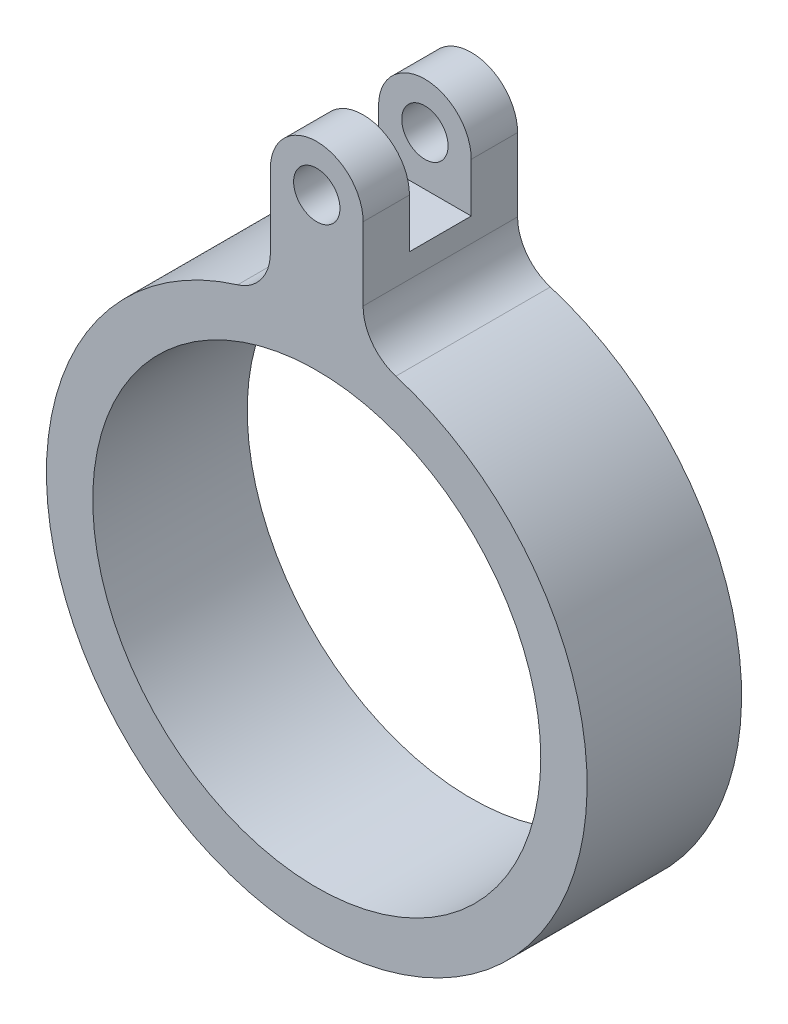
ISO-10303-21;
HEADER;
FILE_DESCRIPTION(('STEP AP214'),'2;1');
FILE_NAME('part.step','',(''),(''),'','','');
FILE_SCHEMA(('AUTOMOTIVE_DESIGN { 1 0 10303 214 1 1 1 1 }'));
ENDSEC;
DATA;
#1=APPLICATION_CONTEXT('core data for automotive mechanical design processes');
#2=APPLICATION_PROTOCOL_DEFINITION('international standard','automotive_design',2000,#1);
#3=PRODUCT_CONTEXT('',#1,'mechanical');
#4=PRODUCT('Part','Part','',(#3));
#5=PRODUCT_RELATED_PRODUCT_CATEGORY('part','',(#4));
#6=PRODUCT_DEFINITION_FORMATION('','',#4);
#7=PRODUCT_DEFINITION_CONTEXT('part definition',#1,'design');
#8=PRODUCT_DEFINITION('design','',#6,#7);
#9=PRODUCT_DEFINITION_SHAPE('','',#8);
#10=(LENGTH_UNIT() NAMED_UNIT(*) SI_UNIT(.MILLI.,.METRE.));
#11=(NAMED_UNIT(*) PLANE_ANGLE_UNIT() SI_UNIT($,.RADIAN.));
#12=(NAMED_UNIT(*) SI_UNIT($,.STERADIAN.) SOLID_ANGLE_UNIT());
#13=UNCERTAINTY_MEASURE_WITH_UNIT(LENGTH_MEASURE(1.E-05),#10,'distance_accuracy_value','');
#14=(GEOMETRIC_REPRESENTATION_CONTEXT(3) GLOBAL_UNCERTAINTY_ASSIGNED_CONTEXT((#13)) GLOBAL_UNIT_ASSIGNED_CONTEXT((#10,
#11,#12)) REPRESENTATION_CONTEXT('',''));
#15=CARTESIAN_POINT('',(0.,0.,0.));
#16=DIRECTION('',(0.,0.,1.));
#17=DIRECTION('',(1.,0.,0.));
#18=AXIS2_PLACEMENT_3D('',#15,#16,#17);
#19=CARTESIAN_POINT('',(-3.,19.2508213160359,0.));
#20=DIRECTION('',(-1.,0.,0.));
#21=DIRECTION('',(0.,0.,1.));
#22=AXIS2_PLACEMENT_3D('',#19,#20,#21);
#23=PLANE('',#22);
#24=DIRECTION('',(0.,0.,-1.));
#25=VECTOR('',#24,1.);
#26=CARTESIAN_POINT('',(-3.,21.1484024479483,0.));
#27=LINE('',#26,#25);
#28=CARTESIAN_POINT('',(-3.,21.1484024479483,7.));
#29=VERTEX_POINT('',#28);
#30=CARTESIAN_POINT('',(-3.,21.1484024479483,3.));
#31=VERTEX_POINT('',#30);
#32=EDGE_CURVE('E136',#29,#31,#27,.T.);
#33=ORIENTED_EDGE('',*,*,#32,.T.);
#34=DIRECTION('',(0.,1.,0.));
#35=VECTOR('',#34,1.);
#36=CARTESIAN_POINT('',(-3.,19.2508213160359,3.));
#37=LINE('',#36,#35);
#38=CARTESIAN_POINT('',(-3.,24.3278757810565,3.));
#39=VERTEX_POINT('',#38);
#40=EDGE_CURVE('E147',#31,#39,#37,.T.);
#41=ORIENTED_EDGE('',*,*,#40,.T.);
#42=DIRECTION('',(0.,0.,1.));
#43=VECTOR('',#42,1.);
#44=CARTESIAN_POINT('',(-3.,24.3278757810565,0.));
#45=LINE('',#44,#43);
#46=CARTESIAN_POINT('',(-3.,24.3278757810565,0.));
#47=VERTEX_POINT('',#46);
#48=EDGE_CURVE('E179',#47,#39,#45,.T.);
#49=ORIENTED_EDGE('',*,*,#48,.F.);
#50=DIRECTION('',(0.,-1.,0.));
#51=VECTOR('',#50,1.);
#52=CARTESIAN_POINT('',(-3.,24.3278757810565,0.));
#53=LINE('',#52,#51);
#54=CARTESIAN_POINT('',(-3.,19.6022957839127,0.));
#55=VERTEX_POINT('',#54);
#56=EDGE_CURVE('E171',#47,#55,#53,.T.);
#57=ORIENTED_EDGE('',*,*,#56,.T.);
#58=DIRECTION('',(0.,0.,-1.));
#59=VECTOR('',#58,1.);
#60=CARTESIAN_POINT('',(-3.,19.6022957839127,0.));
#61=LINE('',#60,#59);
#62=CARTESIAN_POINT('',(-3.,19.6022957839127,10.));
#63=VERTEX_POINT('',#62);
#64=EDGE_CURVE('E201',#55,#63,#61,.F.);
#65=ORIENTED_EDGE('',*,*,#64,.T.);
#66=DIRECTION('',(0.,-1.,0.));
#67=VECTOR('',#66,1.);
#68=CARTESIAN_POINT('',(-3.,19.2508213160359,10.));
#69=LINE('',#68,#67);
#70=CARTESIAN_POINT('',(-3.,24.3278757810565,10.));
#71=VERTEX_POINT('',#70);
#72=EDGE_CURVE('E172',#71,#63,#69,.T.);
#73=ORIENTED_EDGE('',*,*,#72,.F.);
#74=CARTESIAN_POINT('',(-3.,24.3278757810565,7.));
#75=VERTEX_POINT('',#74);
#76=EDGE_CURVE('E183',#75,#71,#45,.T.);
#77=ORIENTED_EDGE('',*,*,#76,.F.);
#78=DIRECTION('',(0.,1.,0.));
#79=VECTOR('',#78,1.);
#80=CARTESIAN_POINT('',(-3.,19.2508213160359,7.));
#81=LINE('',#80,#79);
#82=EDGE_CURVE('E60',#29,#75,#81,.T.);
#83=ORIENTED_EDGE('',*,*,#82,.F.);
#84=EDGE_LOOP('',(#33,#41,#49,#57,#65,#73,#77,#83));
#85=FACE_BOUND('',#84,.T.);
#86=ADVANCED_FACE('F45',(#85),#23,.T.);
#87=CARTESIAN_POINT('',(3.,24.3278757810565,0.));
#88=DIRECTION('',(1.,0.,0.));
#89=DIRECTION('',(0.,0.,-1.));
#90=AXIS2_PLACEMENT_3D('',#87,#88,#89);
#91=PLANE('',#90);
#92=DIRECTION('',(0.,0.,1.));
#93=VECTOR('',#92,1.);
#94=CARTESIAN_POINT('',(3.,24.3278757810565,0.));
#95=LINE('',#94,#93);
#96=CARTESIAN_POINT('',(3.,24.3278757810565,0.));
#97=VERTEX_POINT('',#96);
#98=CARTESIAN_POINT('',(3.,24.3278757810565,3.));
#99=VERTEX_POINT('',#98);
#100=EDGE_CURVE('E144',#97,#99,#95,.T.);
#101=ORIENTED_EDGE('',*,*,#100,.T.);
#102=DIRECTION('',(0.,-1.,0.));
#103=VECTOR('',#102,1.);
#104=CARTESIAN_POINT('',(3.,24.3278757810565,3.));
#105=LINE('',#104,#103);
#106=CARTESIAN_POINT('',(3.,21.1484024479483,3.));
#107=VERTEX_POINT('',#106);
#108=EDGE_CURVE('E142',#99,#107,#105,.T.);
#109=ORIENTED_EDGE('',*,*,#108,.T.);
#110=DIRECTION('',(0.,0.,1.));
#111=VECTOR('',#110,1.);
#112=CARTESIAN_POINT('',(3.,21.1484024479483,0.));
#113=LINE('',#112,#111);
#114=CARTESIAN_POINT('',(3.,21.1484024479483,7.));
#115=VERTEX_POINT('',#114);
#116=EDGE_CURVE('E13',#107,#115,#113,.T.);
#117=ORIENTED_EDGE('',*,*,#116,.T.);
#118=DIRECTION('',(0.,-1.,0.));
#119=VECTOR('',#118,1.);
#120=CARTESIAN_POINT('',(3.,24.3278757810565,7.));
#121=LINE('',#120,#119);
#122=CARTESIAN_POINT('',(3.,24.3278757810565,7.));
#123=VERTEX_POINT('',#122);
#124=EDGE_CURVE('E122',#123,#115,#121,.T.);
#125=ORIENTED_EDGE('',*,*,#124,.F.);
#126=CARTESIAN_POINT('',(3.,24.3278757810565,10.));
#127=VERTEX_POINT('',#126);
#128=EDGE_CURVE('E175',#123,#127,#95,.T.);
#129=ORIENTED_EDGE('',*,*,#128,.T.);
#130=DIRECTION('',(0.,1.,0.));
#131=VECTOR('',#130,1.);
#132=CARTESIAN_POINT('',(3.,24.3278757810565,10.));
#133=LINE('',#132,#131);
#134=CARTESIAN_POINT('',(3.,19.6022957839127,10.));
#135=VERTEX_POINT('',#134);
#136=EDGE_CURVE('E166',#135,#127,#133,.T.);
#137=ORIENTED_EDGE('',*,*,#136,.F.);
#138=DIRECTION('',(0.,0.,-1.));
#139=VECTOR('',#138,1.);
#140=CARTESIAN_POINT('',(3.,19.6022957839127,0.));
#141=LINE('',#140,#139);
#142=CARTESIAN_POINT('',(3.,19.6022957839127,0.));
#143=VERTEX_POINT('',#142);
#144=EDGE_CURVE('E203',#135,#143,#141,.T.);
#145=ORIENTED_EDGE('',*,*,#144,.T.);
#146=DIRECTION('',(0.,1.,0.));
#147=VECTOR('',#146,1.);
#148=CARTESIAN_POINT('',(3.,16.4304412725826,0.));
#149=LINE('',#148,#147);
#150=EDGE_CURVE('E169',#143,#97,#149,.T.);
#151=ORIENTED_EDGE('',*,*,#150,.T.);
#152=EDGE_LOOP('',(#101,#109,#117,#125,#129,#137,#145,#151));
#153=FACE_BOUND('',#152,.T.);
#154=ADVANCED_FACE('F141',(#153),#91,.T.);
#155=CARTESIAN_POINT('',(0.,24.3278757810565,0.));
#156=DIRECTION('',(0.,0.,1.));
#157=DIRECTION('',(1.,0.,0.));
#158=AXIS2_PLACEMENT_3D('',#155,#156,#157);
#159=CYLINDRICAL_SURFACE('',#158,3.);
#160=ORIENTED_EDGE('',*,*,#48,.T.);
#161=CARTESIAN_POINT('',(0.,24.3278757810565,3.));
#162=DIRECTION('',(0.,0.,1.));
#163=DIRECTION('',(1.,0.,0.));
#164=AXIS2_PLACEMENT_3D('',#161,#162,#163);
#165=CIRCLE('',#164,3.);
#166=EDGE_CURVE('E148',#39,#99,#165,.F.);
#167=ORIENTED_EDGE('',*,*,#166,.T.);
#168=ORIENTED_EDGE('',*,*,#100,.F.);
#169=CARTESIAN_POINT('',(0.,24.3278757810565,0.));
#170=DIRECTION('',(0.,0.,1.));
#171=DIRECTION('',(1.,0.,0.));
#172=AXIS2_PLACEMENT_3D('',#169,#170,#171);
#173=CIRCLE('',#172,3.);
#174=EDGE_CURVE('E164',#97,#47,#173,.T.);
#175=ORIENTED_EDGE('',*,*,#174,.T.);
#176=EDGE_LOOP('',(#160,#167,#168,#175));
#177=FACE_BOUND('',#176,.T.);
#178=ADVANCED_FACE('F247',(#177),#159,.T.);
#179=CARTESIAN_POINT('',(0.,24.3278757810565,0.));
#180=DIRECTION('',(0.,0.,1.));
#181=DIRECTION('',(1.,0.,0.));
#182=AXIS2_PLACEMENT_3D('',#179,#180,#181);
#183=CYLINDRICAL_SURFACE('',#182,1.5);
#184=CARTESIAN_POINT('',(0.,24.3278757810565,0.));
#185=DIRECTION('',(0.,0.,1.));
#186=DIRECTION('',(1.,0.,0.));
#187=AXIS2_PLACEMENT_3D('',#184,#185,#186);
#188=CIRCLE('',#187,1.5);
#189=CARTESIAN_POINT('',(1.5,24.3278757810565,0.));
#190=VERTEX_POINT('',#189);
#191=EDGE_CURVE('E158',#190,#190,#188,.T.);
#192=ORIENTED_EDGE('',*,*,#191,.F.);
#193=EDGE_LOOP('',(#192));
#194=FACE_BOUND('',#193,.T.);
#195=CARTESIAN_POINT('',(0.,24.3278757810565,3.));
#196=DIRECTION('',(0.,0.,1.));
#197=DIRECTION('',(1.,0.,0.));
#198=AXIS2_PLACEMENT_3D('',#195,#196,#197);
#199=CIRCLE('',#198,1.5);
#200=CARTESIAN_POINT('',(1.5,24.3278757810565,3.));
#201=VERTEX_POINT('',#200);
#202=EDGE_CURVE('E152',#201,#201,#199,.F.);
#203=ORIENTED_EDGE('',*,*,#202,.F.);
#204=EDGE_LOOP('',(#203));
#205=FACE_BOUND('',#204,.T.);
#206=ADVANCED_FACE('F259',(#194,#205),#183,.F.);
#207=CARTESIAN_POINT('',(0.,0.,10.));
#208=DIRECTION('',(0.,0.,1.));
#209=DIRECTION('',(1.,0.,0.));
#210=AXIS2_PLACEMENT_3D('',#207,#208,#209);
#211=PLANE('',#210);
#212=CARTESIAN_POINT('',(0.,24.3278757810565,10.));
#213=DIRECTION('',(0.,0.,1.));
#214=DIRECTION('',(1.,0.,0.));
#215=AXIS2_PLACEMENT_3D('',#212,#213,#214);
#216=CIRCLE('',#215,1.5);
#217=CARTESIAN_POINT('',(1.5,24.3278757810565,10.));
#218=VERTEX_POINT('',#217);
#219=EDGE_CURVE('E157',#218,#218,#216,.T.);
#220=ORIENTED_EDGE('',*,*,#219,.F.);
#221=EDGE_LOOP('',(#220));
#222=FACE_BOUND('',#221,.T.);
#223=CARTESIAN_POINT('',(0.,0.,10.));
#224=DIRECTION('',(0.,0.,1.));
#225=DIRECTION('',(1.,0.,0.));
#226=AXIS2_PLACEMENT_3D('',#223,#224,#225);
#227=CIRCLE('',#226,17.5);
#228=CARTESIAN_POINT('',(-5.1219512195122,16.7336671326084,10.));
#229=VERTEX_POINT('',#228);
#230=CARTESIAN_POINT('',(5.1219512195122,16.7336671326084,10.));
#231=VERTEX_POINT('',#230);
#232=EDGE_CURVE('E191',#229,#231,#227,.T.);
#233=ORIENTED_EDGE('',*,*,#232,.T.);
#234=CARTESIAN_POINT('',(6.,19.6022957839127,10.));
#235=DIRECTION('',(0.,0.,1.));
#236=DIRECTION('',(1.,0.,0.));
#237=AXIS2_PLACEMENT_3D('',#234,#235,#236);
#238=CIRCLE('',#237,3.);
#239=EDGE_CURVE('E68',#231,#135,#238,.F.);
#240=ORIENTED_EDGE('',*,*,#239,.T.);
#241=ORIENTED_EDGE('',*,*,#136,.T.);
#242=CARTESIAN_POINT('',(0.,24.3278757810565,10.));
#243=DIRECTION('',(0.,0.,1.));
#244=DIRECTION('',(1.,0.,0.));
#245=AXIS2_PLACEMENT_3D('',#242,#243,#244);
#246=CIRCLE('',#245,3.);
#247=EDGE_CURVE('E161',#127,#71,#246,.T.);
#248=ORIENTED_EDGE('',*,*,#247,.T.);
#249=ORIENTED_EDGE('',*,*,#72,.T.);
#250=CARTESIAN_POINT('',(-6.,19.6022957839127,10.));
#251=DIRECTION('',(0.,0.,1.));
#252=DIRECTION('',(1.,0.,0.));
#253=AXIS2_PLACEMENT_3D('',#250,#251,#252);
#254=CIRCLE('',#253,3.);
#255=EDGE_CURVE('E207',#63,#229,#254,.F.);
#256=ORIENTED_EDGE('',*,*,#255,.T.);
#257=EDGE_LOOP('',(#233,#240,#241,#248,#249,#256));
#258=FACE_BOUND('',#257,.T.);
#259=CARTESIAN_POINT('',(0.,0.,10.));
#260=DIRECTION('',(0.,0.,1.));
#261=DIRECTION('',(1.,0.,0.));
#262=AXIS2_PLACEMENT_3D('',#259,#260,#261);
#263=CIRCLE('',#262,14.5);
#264=CARTESIAN_POINT('',(14.5,0.,10.));
#265=VERTEX_POINT('',#264);
#266=EDGE_CURVE('E185',#265,#265,#263,.T.);
#267=ORIENTED_EDGE('',*,*,#266,.F.);
#268=EDGE_LOOP('',(#267));
#269=FACE_BOUND('',#268,.T.);
#270=ADVANCED_FACE('F225',(#222,#258,#269),#211,.T.);
#271=CARTESIAN_POINT('',(0.,0.,0.));
#272=DIRECTION('',(0.,0.,1.));
#273=DIRECTION('',(1.,0.,0.));
#274=AXIS2_PLACEMENT_3D('',#271,#272,#273);
#275=PLANE('',#274);
#276=ORIENTED_EDGE('',*,*,#191,.T.);
#277=EDGE_LOOP('',(#276));
#278=FACE_BOUND('',#277,.T.);
#279=ORIENTED_EDGE('',*,*,#56,.F.);
#280=ORIENTED_EDGE('',*,*,#174,.F.);
#281=ORIENTED_EDGE('',*,*,#150,.F.);
#282=CARTESIAN_POINT('',(6.,19.6022957839127,0.));
#283=DIRECTION('',(0.,0.,1.));
#284=DIRECTION('',(1.,0.,0.));
#285=AXIS2_PLACEMENT_3D('',#282,#283,#284);
#286=CIRCLE('',#285,3.);
#287=CARTESIAN_POINT('',(5.1219512195122,16.7336671326084,0.));
#288=VERTEX_POINT('',#287);
#289=EDGE_CURVE('E53',#143,#288,#286,.T.);
#290=ORIENTED_EDGE('',*,*,#289,.T.);
#291=CARTESIAN_POINT('',(0.,0.,0.));
#292=DIRECTION('',(0.,0.,1.));
#293=DIRECTION('',(1.,0.,0.));
#294=AXIS2_PLACEMENT_3D('',#291,#292,#293);
#295=CIRCLE('',#294,17.5);
#296=CARTESIAN_POINT('',(-5.1219512195122,16.7336671326084,0.));
#297=VERTEX_POINT('',#296);
#298=EDGE_CURVE('E188',#297,#288,#295,.T.);
#299=ORIENTED_EDGE('',*,*,#298,.F.);
#300=CARTESIAN_POINT('',(-6.,19.6022957839127,0.));
#301=DIRECTION('',(0.,0.,1.));
#302=DIRECTION('',(1.,0.,0.));
#303=AXIS2_PLACEMENT_3D('',#300,#301,#302);
#304=CIRCLE('',#303,3.);
#305=EDGE_CURVE('E205',#297,#55,#304,.T.);
#306=ORIENTED_EDGE('',*,*,#305,.T.);
#307=EDGE_LOOP('',(#279,#280,#281,#290,#299,#306));
#308=FACE_BOUND('',#307,.T.);
#309=CARTESIAN_POINT('',(0.,0.,0.));
#310=DIRECTION('',(0.,0.,1.));
#311=DIRECTION('',(1.,0.,0.));
#312=AXIS2_PLACEMENT_3D('',#309,#310,#311);
#313=CIRCLE('',#312,14.5);
#314=CARTESIAN_POINT('',(14.5,0.,0.));
#315=VERTEX_POINT('',#314);
#316=EDGE_CURVE('E182',#315,#315,#313,.T.);
#317=ORIENTED_EDGE('',*,*,#316,.T.);
#318=EDGE_LOOP('',(#317));
#319=FACE_BOUND('',#318,.T.);
#320=ADVANCED_FACE('F236',(#278,#308,#319),#275,.F.);
#321=CARTESIAN_POINT('',(0.,0.,10.));
#322=DIRECTION('',(0.,0.,-1.));
#323=DIRECTION('',(-1.,0.,0.));
#324=AXIS2_PLACEMENT_3D('',#321,#322,#323);
#325=CYLINDRICAL_SURFACE('',#324,17.5);
#326=ORIENTED_EDGE('',*,*,#232,.F.);
#327=DIRECTION('',(0.,0.,-1.));
#328=VECTOR('',#327,1.);
#329=CARTESIAN_POINT('',(-5.1219512195122,16.7336671326084,10.));
#330=LINE('',#329,#328);
#331=EDGE_CURVE('E198',#229,#297,#330,.T.);
#332=ORIENTED_EDGE('',*,*,#331,.T.);
#333=ORIENTED_EDGE('',*,*,#298,.T.);
#334=DIRECTION('',(0.,0.,-1.));
#335=VECTOR('',#334,1.);
#336=CARTESIAN_POINT('',(5.1219512195122,16.7336671326084,10.));
#337=LINE('',#336,#335);
#338=EDGE_CURVE('E193',#288,#231,#337,.F.);
#339=ORIENTED_EDGE('',*,*,#338,.T.);
#340=EDGE_LOOP('',(#326,#332,#333,#339));
#341=FACE_BOUND('',#340,.T.);
#342=ADVANCED_FACE('F241',(#341),#325,.T.);
#343=CARTESIAN_POINT('',(0.,0.,10.));
#344=DIRECTION('',(0.,0.,-1.));
#345=DIRECTION('',(-1.,0.,0.));
#346=AXIS2_PLACEMENT_3D('',#343,#344,#345);
#347=CYLINDRICAL_SURFACE('',#346,14.5);
#348=ORIENTED_EDGE('',*,*,#266,.T.);
#349=EDGE_LOOP('',(#348));
#350=FACE_BOUND('',#349,.T.);
#351=ORIENTED_EDGE('',*,*,#316,.F.);
#352=EDGE_LOOP('',(#351));
#353=FACE_BOUND('',#352,.T.);
#354=ADVANCED_FACE('F268',(#350,#353),#347,.F.);
#355=CARTESIAN_POINT('',(0.,24.3278757810565,7.));
#356=DIRECTION('',(0.,0.,1.));
#357=DIRECTION('',(1.,0.,0.));
#358=AXIS2_PLACEMENT_3D('',#355,#356,#357);
#359=CIRCLE('',#358,3.);
#360=EDGE_CURVE('E127',#75,#123,#359,.F.);
#361=ORIENTED_EDGE('',*,*,#360,.F.);
#362=ORIENTED_EDGE('',*,*,#76,.T.);
#363=ORIENTED_EDGE('',*,*,#247,.F.);
#364=ORIENTED_EDGE('',*,*,#128,.F.);
#365=EDGE_LOOP('',(#361,#362,#363,#364));
#366=FACE_BOUND('',#365,.T.);
#367=ADVANCED_FACE('F224',(#366),#159,.T.);
#368=CARTESIAN_POINT('',(-6.,19.6022957839127,10.));
#369=DIRECTION('',(0.,0.,-1.));
#370=DIRECTION('',(-1.,0.,0.));
#371=AXIS2_PLACEMENT_3D('',#368,#369,#370);
#372=CYLINDRICAL_SURFACE('',#371,3.);
#373=ORIENTED_EDGE('',*,*,#255,.F.);
#374=ORIENTED_EDGE('',*,*,#64,.F.);
#375=ORIENTED_EDGE('',*,*,#305,.F.);
#376=ORIENTED_EDGE('',*,*,#331,.F.);
#377=EDGE_LOOP('',(#373,#374,#375,#376));
#378=FACE_BOUND('',#377,.T.);
#379=ADVANCED_FACE('F244',(#378),#372,.F.);
#380=CARTESIAN_POINT('',(6.,19.6022957839127,10.));
#381=DIRECTION('',(0.,0.,-1.));
#382=DIRECTION('',(-1.,0.,0.));
#383=AXIS2_PLACEMENT_3D('',#380,#381,#382);
#384=CYLINDRICAL_SURFACE('',#383,3.);
#385=ORIENTED_EDGE('',*,*,#289,.F.);
#386=ORIENTED_EDGE('',*,*,#144,.F.);
#387=ORIENTED_EDGE('',*,*,#239,.F.);
#388=ORIENTED_EDGE('',*,*,#338,.F.);
#389=EDGE_LOOP('',(#385,#386,#387,#388));
#390=FACE_BOUND('',#389,.T.);
#391=ADVANCED_FACE('F47',(#390),#384,.F.);
#392=CARTESIAN_POINT('',(0.,24.3278757810565,7.));
#393=DIRECTION('',(0.,0.,1.));
#394=DIRECTION('',(1.,0.,0.));
#395=AXIS2_PLACEMENT_3D('',#392,#393,#394);
#396=CIRCLE('',#395,1.5);
#397=CARTESIAN_POINT('',(1.5,24.3278757810565,7.));
#398=VERTEX_POINT('',#397);
#399=EDGE_CURVE('E211',#398,#398,#396,.F.);
#400=ORIENTED_EDGE('',*,*,#399,.T.);
#401=EDGE_LOOP('',(#400));
#402=FACE_BOUND('',#401,.T.);
#403=ORIENTED_EDGE('',*,*,#219,.T.);
#404=EDGE_LOOP('',(#403));
#405=FACE_BOUND('',#404,.T.);
#406=ADVANCED_FACE('F250',(#402,#405),#183,.F.);
#407=CARTESIAN_POINT('',(0.,0.,3.));
#408=DIRECTION('',(0.,0.,1.));
#409=DIRECTION('',(1.,0.,0.));
#410=AXIS2_PLACEMENT_3D('',#407,#408,#409);
#411=PLANE('',#410);
#412=DIRECTION('',(-1.,0.,0.));
#413=VECTOR('',#412,1.);
#414=CARTESIAN_POINT('',(0.,21.1484024479483,3.));
#415=LINE('',#414,#413);
#416=EDGE_CURVE('E137',#107,#31,#415,.T.);
#417=ORIENTED_EDGE('',*,*,#416,.F.);
#418=ORIENTED_EDGE('',*,*,#108,.F.);
#419=ORIENTED_EDGE('',*,*,#166,.F.);
#420=ORIENTED_EDGE('',*,*,#40,.F.);
#421=EDGE_LOOP('',(#417,#418,#419,#420));
#422=FACE_BOUND('',#421,.T.);
#423=ORIENTED_EDGE('',*,*,#202,.T.);
#424=EDGE_LOOP('',(#423));
#425=FACE_BOUND('',#424,.T.);
#426=ADVANCED_FACE('F248',(#422,#425),#411,.T.);
#427=CARTESIAN_POINT('',(0.,0.,7.));
#428=DIRECTION('',(0.,0.,1.));
#429=DIRECTION('',(1.,0.,0.));
#430=AXIS2_PLACEMENT_3D('',#427,#428,#429);
#431=PLANE('',#430);
#432=ORIENTED_EDGE('',*,*,#82,.T.);
#433=ORIENTED_EDGE('',*,*,#360,.T.);
#434=ORIENTED_EDGE('',*,*,#124,.T.);
#435=DIRECTION('',(-1.,0.,0.));
#436=VECTOR('',#435,1.);
#437=CARTESIAN_POINT('',(0.,21.1484024479483,7.));
#438=LINE('',#437,#436);
#439=EDGE_CURVE('E126',#115,#29,#438,.T.);
#440=ORIENTED_EDGE('',*,*,#439,.T.);
#441=EDGE_LOOP('',(#432,#433,#434,#440));
#442=FACE_BOUND('',#441,.T.);
#443=ORIENTED_EDGE('',*,*,#399,.F.);
#444=EDGE_LOOP('',(#443));
#445=FACE_BOUND('',#444,.T.);
#446=ADVANCED_FACE('F124',(#442,#445),#431,.F.);
#447=CARTESIAN_POINT('',(0.,21.1484024479483,3.));
#448=DIRECTION('',(0.,1.,0.));
#449=DIRECTION('',(0.,0.,1.));
#450=AXIS2_PLACEMENT_3D('',#447,#448,#449);
#451=PLANE('',#450);
#452=ORIENTED_EDGE('',*,*,#439,.F.);
#453=ORIENTED_EDGE('',*,*,#116,.F.);
#454=ORIENTED_EDGE('',*,*,#416,.T.);
#455=ORIENTED_EDGE('',*,*,#32,.F.);
#456=EDGE_LOOP('',(#452,#453,#454,#455));
#457=FACE_BOUND('',#456,.T.);
#458=ADVANCED_FACE('F132',(#457),#451,.T.);
#459=CLOSED_SHELL('',(#86,#154,#178,#206,#270,#320,#342,#354,#367,#379,#391,#406,#426,#446,#458));
#460=MANIFOLD_SOLID_BREP('B2',#459);
#461=ADVANCED_BREP_SHAPE_REPRESENTATION('',(#18,#460),#14);
#462=SHAPE_DEFINITION_REPRESENTATION(#9,#461);
ENDSEC;
END-ISO-10303-21;
